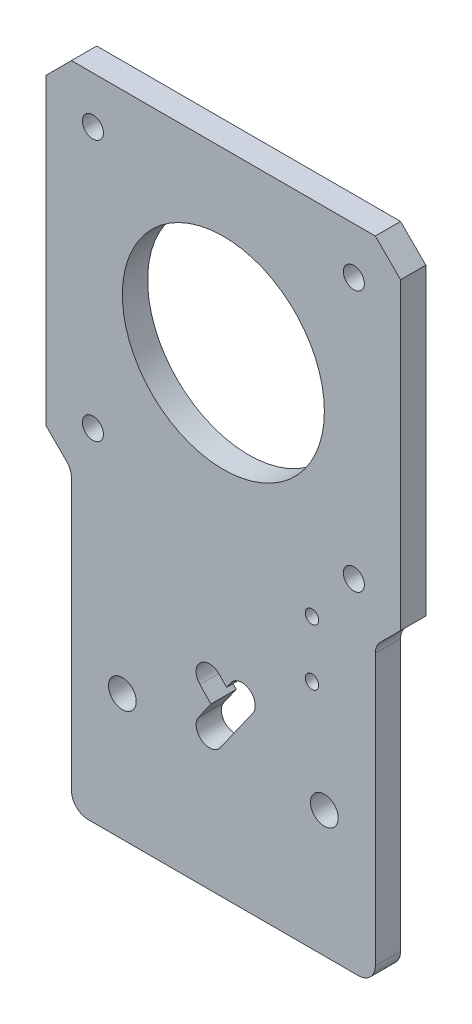
ISO-10303-21;
HEADER;
FILE_DESCRIPTION(('STEP AP214'),'2;1');
FILE_NAME('part.step','',(''),(''),'','','');
FILE_SCHEMA(('AUTOMOTIVE_DESIGN { 1 0 10303 214 1 1 1 1 }'));
ENDSEC;
DATA;
#1=APPLICATION_CONTEXT('core data for automotive mechanical design processes');
#2=APPLICATION_PROTOCOL_DEFINITION('international standard','automotive_design',2000,#1);
#3=PRODUCT_CONTEXT('',#1,'mechanical');
#4=PRODUCT('Part','Part','',(#3));
#5=PRODUCT_RELATED_PRODUCT_CATEGORY('part','',(#4));
#6=PRODUCT_DEFINITION_FORMATION('','',#4);
#7=PRODUCT_DEFINITION_CONTEXT('part definition',#1,'design');
#8=PRODUCT_DEFINITION('design','',#6,#7);
#9=PRODUCT_DEFINITION_SHAPE('','',#8);
#10=(LENGTH_UNIT() NAMED_UNIT(*) SI_UNIT(.MILLI.,.METRE.));
#11=(NAMED_UNIT(*) PLANE_ANGLE_UNIT() SI_UNIT($,.RADIAN.));
#12=(NAMED_UNIT(*) SI_UNIT($,.STERADIAN.) SOLID_ANGLE_UNIT());
#13=UNCERTAINTY_MEASURE_WITH_UNIT(LENGTH_MEASURE(1.E-05),#10,'distance_accuracy_value','');
#14=(GEOMETRIC_REPRESENTATION_CONTEXT(3) GLOBAL_UNCERTAINTY_ASSIGNED_CONTEXT((#13)) GLOBAL_UNIT_ASSIGNED_CONTEXT((#10,
#11,#12)) REPRESENTATION_CONTEXT('',''));
#15=CARTESIAN_POINT('',(0.,0.,0.));
#16=DIRECTION('',(0.,0.,1.));
#17=DIRECTION('',(1.,0.,0.));
#18=AXIS2_PLACEMENT_3D('',#15,#16,#17);
#19=CARTESIAN_POINT('',(0.,0.,3.));
#20=DIRECTION('',(0.,0.,-1.));
#21=DIRECTION('',(-1.,0.,0.));
#22=AXIS2_PLACEMENT_3D('',#19,#20,#21);
#23=PLANE('',#22);
#24=CARTESIAN_POINT('',(-1.64945517730673,-34.4013944195105,3.));
#25=DIRECTION('',(0.,0.,-1.));
#26=DIRECTION('',(-1.,0.,0.));
#27=AXIS2_PLACEMENT_3D('',#24,#25,#26);
#28=CIRCLE('',#27,1.58749999999999);
#29=CARTESIAN_POINT('',(-0.509366671944178,-33.2966978774954,3.));
#30=VERTEX_POINT('',#29);
#31=CARTESIAN_POINT('',(-2.78954368266929,-35.5060909615256,3.));
#32=VERTEX_POINT('',#31);
#33=EDGE_CURVE('E272',#30,#32,#28,.F.);
#34=ORIENTED_EDGE('',*,*,#33,.F.);
#35=DIRECTION('',(0.695871837489854,-0.718165987629945,0.));
#36=VECTOR('',#35,1.);
#37=CARTESIAN_POINT('',(-16.902786394314,-16.3780702922548,3.));
#38=LINE('',#37,#36);
#39=CARTESIAN_POINT('',(0.384994592721698,-34.2197124418635,3.));
#40=VERTEX_POINT('',#39);
#41=EDGE_CURVE('E191',#30,#40,#38,.T.);
#42=ORIENTED_EDGE('',*,*,#41,.T.);
#43=DIRECTION('',(-0.575176751990256,-0.818029158386142,0.));
#44=VECTOR('',#43,1.);
#45=CARTESIAN_POINT('',(16.3583907342518,-11.5019934850208,3.));
#46=LINE('',#45,#44);
#47=CARTESIAN_POINT('',(0.899268033755897,-33.488301325726,3.));
#48=VERTEX_POINT('',#47);
#49=EDGE_CURVE('E195',#48,#40,#46,.T.);
#50=ORIENTED_EDGE('',*,*,#49,.F.);
#51=CARTESIAN_POINT('',(2.19788932269389,-34.4013944195105,3.));
#52=DIRECTION('',(0.,0.,-1.));
#53=DIRECTION('',(-1.,0.,0.));
#54=AXIS2_PLACEMENT_3D('',#51,#52,#53);
#55=CIRCLE('',#54,1.58749999999999);
#56=CARTESIAN_POINT('',(3.49651061163189,-35.3144875132951,3.));
#57=VERTEX_POINT('',#56);
#58=EDGE_CURVE('E256',#57,#48,#55,.F.);
#59=ORIENTED_EDGE('',*,*,#58,.F.);
#60=DIRECTION('',(-0.575176751990257,-0.818029158386141,0.));
#61=VECTOR('',#60,1.);
#62=CARTESIAN_POINT('',(18.9556333121278,-13.3281796725899,3.));
#63=LINE('',#62,#61);
#64=CARTESIAN_POINT('',(-0.350833888368762,-40.7862663577404,3.));
#65=VERTEX_POINT('',#64);
#66=EDGE_CURVE('E259',#57,#65,#63,.T.);
#67=ORIENTED_EDGE('',*,*,#66,.T.);
#68=CARTESIAN_POINT('',(-1.64945517730673,-39.8731732639559,3.));
#69=DIRECTION('',(0.,0.,-1.));
#70=DIRECTION('',(-1.,0.,0.));
#71=AXIS2_PLACEMENT_3D('',#68,#69,#70);
#72=CIRCLE('',#71,1.58749999999999);
#73=CARTESIAN_POINT('',(-2.94807646624474,-38.9600801701714,3.));
#74=VERTEX_POINT('',#73);
#75=EDGE_CURVE('E263',#74,#65,#72,.F.);
#76=ORIENTED_EDGE('',*,*,#75,.F.);
#77=DIRECTION('',(-0.575176751990256,-0.818029158386142,0.));
#78=VECTOR('',#77,1.);
#79=CARTESIAN_POINT('',(16.3583907342518,-11.5019934850208,3.));
#80=LINE('',#79,#78);
#81=CARTESIAN_POINT('',(-1.47406755906194,-36.8637119466225,3.));
#82=VERTEX_POINT('',#81);
#83=EDGE_CURVE('E266',#82,#74,#80,.T.);
#84=ORIENTED_EDGE('',*,*,#83,.F.);
#85=DIRECTION('',(0.695871837489838,-0.71816598762996,0.));
#86=VECTOR('',#85,1.);
#87=CARTESIAN_POINT('',(-19.1829634050391,-18.5874633762843,3.));
#88=LINE('',#87,#86);
#89=EDGE_CURVE('E269',#32,#82,#88,.T.);
#90=ORIENTED_EDGE('',*,*,#89,.F.);
#91=EDGE_LOOP('',(#34,#42,#50,#59,#67,#76,#84,#90));
#92=FACE_BOUND('',#91,.T.);
#93=CARTESIAN_POINT('',(10.5294560297045,-21.8613101499908,3.));
#94=DIRECTION('',(0.,0.,1.));
#95=DIRECTION('',(1.,0.,0.));
#96=AXIS2_PLACEMENT_3D('',#93,#94,#95);
#97=CIRCLE('',#96,0.799999999999999);
#98=CARTESIAN_POINT('',(11.3294560297045,-21.8613101499908,3.));
#99=VERTEX_POINT('',#98);
#100=EDGE_CURVE('E277',#99,#99,#97,.T.);
#101=ORIENTED_EDGE('',*,*,#100,.F.);
#102=EDGE_LOOP('',(#101));
#103=FACE_BOUND('',#102,.T.);
#104=CARTESIAN_POINT('',(10.5294560297045,-28.5613101499908,3.));
#105=DIRECTION('',(0.,0.,1.));
#106=DIRECTION('',(1.,0.,0.));
#107=AXIS2_PLACEMENT_3D('',#104,#105,#106);
#108=CIRCLE('',#107,0.799999999999999);
#109=CARTESIAN_POINT('',(11.3294560297045,-28.5613101499908,3.));
#110=VERTEX_POINT('',#109);
#111=EDGE_CURVE('E285',#110,#110,#108,.T.);
#112=ORIENTED_EDGE('',*,*,#111,.F.);
#113=EDGE_LOOP('',(#112));
#114=FACE_BOUND('',#113,.T.);
#115=CARTESIAN_POINT('',(-12.,-41.0549999999989,3.));
#116=DIRECTION('',(0.,0.,1.));
#117=DIRECTION('',(1.,0.,0.));
#118=AXIS2_PLACEMENT_3D('',#115,#116,#117);
#119=CIRCLE('',#118,1.65);
#120=CARTESIAN_POINT('',(-10.35,-41.0549999999989,3.));
#121=VERTEX_POINT('',#120);
#122=EDGE_CURVE('E293',#121,#121,#119,.T.);
#123=ORIENTED_EDGE('',*,*,#122,.F.);
#124=EDGE_LOOP('',(#123));
#125=FACE_BOUND('',#124,.T.);
#126=CARTESIAN_POINT('',(12.,-41.0549999999989,3.));
#127=DIRECTION('',(0.,0.,1.));
#128=DIRECTION('',(1.,0.,0.));
#129=AXIS2_PLACEMENT_3D('',#126,#127,#128);
#130=CIRCLE('',#129,1.65);
#131=CARTESIAN_POINT('',(13.65,-41.0549999999989,3.));
#132=VERTEX_POINT('',#131);
#133=EDGE_CURVE('E301',#132,#132,#130,.T.);
#134=ORIENTED_EDGE('',*,*,#133,.F.);
#135=EDGE_LOOP('',(#134));
#136=FACE_BOUND('',#135,.T.);
#137=CARTESIAN_POINT('',(-15.5,15.4999999999999,3.));
#138=DIRECTION('',(0.,0.,1.));
#139=DIRECTION('',(1.,0.,0.));
#140=AXIS2_PLACEMENT_3D('',#137,#138,#139);
#141=CIRCLE('',#140,1.24999999999999);
#142=CARTESIAN_POINT('',(-14.25,15.4999999999999,3.));
#143=VERTEX_POINT('',#142);
#144=EDGE_CURVE('E309',#143,#143,#141,.T.);
#145=ORIENTED_EDGE('',*,*,#144,.F.);
#146=EDGE_LOOP('',(#145));
#147=FACE_BOUND('',#146,.T.);
#148=CARTESIAN_POINT('',(15.5,15.4999999999999,3.));
#149=DIRECTION('',(0.,0.,1.));
#150=DIRECTION('',(1.,0.,0.));
#151=AXIS2_PLACEMENT_3D('',#148,#149,#150);
#152=CIRCLE('',#151,1.24999999999999);
#153=CARTESIAN_POINT('',(16.75,15.4999999999999,3.));
#154=VERTEX_POINT('',#153);
#155=EDGE_CURVE('E317',#154,#154,#152,.T.);
#156=ORIENTED_EDGE('',*,*,#155,.F.);
#157=EDGE_LOOP('',(#156));
#158=FACE_BOUND('',#157,.T.);
#159=CARTESIAN_POINT('',(-15.5,-15.5000000000001,3.));
#160=DIRECTION('',(0.,0.,1.));
#161=DIRECTION('',(1.,0.,0.));
#162=AXIS2_PLACEMENT_3D('',#159,#160,#161);
#163=CIRCLE('',#162,1.24999999999999);
#164=CARTESIAN_POINT('',(-14.25,-15.5000000000001,3.));
#165=VERTEX_POINT('',#164);
#166=EDGE_CURVE('E322',#165,#165,#163,.T.);
#167=ORIENTED_EDGE('',*,*,#166,.F.);
#168=EDGE_LOOP('',(#167));
#169=FACE_BOUND('',#168,.T.);
#170=CARTESIAN_POINT('',(15.5,-15.5000000000001,3.));
#171=DIRECTION('',(0.,0.,1.));
#172=DIRECTION('',(1.,0.,0.));
#173=AXIS2_PLACEMENT_3D('',#170,#171,#172);
#174=CIRCLE('',#173,1.24999999999999);
#175=CARTESIAN_POINT('',(16.75,-15.5000000000001,3.));
#176=VERTEX_POINT('',#175);
#177=EDGE_CURVE('E330',#176,#176,#174,.T.);
#178=ORIENTED_EDGE('',*,*,#177,.F.);
#179=EDGE_LOOP('',(#178));
#180=FACE_BOUND('',#179,.T.);
#181=DIRECTION('',(1.,0.,0.));
#182=VECTOR('',#181,1.);
#183=CARTESIAN_POINT('',(18.05,-56.0549999999989,3.));
#184=LINE('',#183,#182);
#185=CARTESIAN_POINT('',(-16.05,-56.0549999999989,3.));
#186=VERTEX_POINT('',#185);
#187=CARTESIAN_POINT('',(16.05,-56.0549999999989,3.));
#188=VERTEX_POINT('',#187);
#189=EDGE_CURVE('E357',#186,#188,#184,.T.);
#190=ORIENTED_EDGE('',*,*,#189,.T.);
#191=CARTESIAN_POINT('',(16.05,-54.0549999999989,3.));
#192=DIRECTION('',(0.,0.,-1.));
#193=DIRECTION('',(-1.,0.,0.));
#194=AXIS2_PLACEMENT_3D('',#191,#192,#193);
#195=CIRCLE('',#194,2.);
#196=CARTESIAN_POINT('',(18.05,-54.0549999999989,3.));
#197=VERTEX_POINT('',#196);
#198=EDGE_CURVE('E470',#188,#197,#195,.F.);
#199=ORIENTED_EDGE('',*,*,#198,.T.);
#200=DIRECTION('',(0.,1.,0.));
#201=VECTOR('',#200,1.);
#202=CARTESIAN_POINT('',(18.05,-56.0549999999989,3.));
#203=LINE('',#202,#201);
#204=CARTESIAN_POINT('',(18.05,-21.8784271247463,3.));
#205=VERTEX_POINT('',#204);
#206=EDGE_CURVE('E361',#197,#205,#203,.T.);
#207=ORIENTED_EDGE('',*,*,#206,.T.);
#208=CARTESIAN_POINT('',(20.05,-21.8784271247463,3.));
#209=DIRECTION('',(0.,0.,-1.));
#210=DIRECTION('',(-1.,0.,0.));
#211=AXIS2_PLACEMENT_3D('',#208,#209,#210);
#212=CIRCLE('',#211,2.);
#213=CARTESIAN_POINT('',(18.6357864376269,-20.4642135623732,3.));
#214=VERTEX_POINT('',#213);
#215=EDGE_CURVE('E486',#205,#214,#212,.T.);
#216=ORIENTED_EDGE('',*,*,#215,.T.);
#217=DIRECTION('',(0.707106781186547,0.707106781186548,0.));
#218=VECTOR('',#217,1.);
#219=CARTESIAN_POINT('',(18.05,-21.0500000000001,3.));
#220=LINE('',#219,#218);
#221=CARTESIAN_POINT('',(21.05,-18.0500000000001,3.));
#222=VERTEX_POINT('',#221);
#223=EDGE_CURVE('E365',#214,#222,#220,.T.);
#224=ORIENTED_EDGE('',*,*,#223,.T.);
#225=DIRECTION('',(0.,1.,0.));
#226=VECTOR('',#225,1.);
#227=CARTESIAN_POINT('',(21.05,-18.0500000000001,3.));
#228=LINE('',#227,#226);
#229=CARTESIAN_POINT('',(21.05,18.0499999999999,3.));
#230=VERTEX_POINT('',#229);
#231=EDGE_CURVE('E368',#222,#230,#228,.T.);
#232=ORIENTED_EDGE('',*,*,#231,.T.);
#233=DIRECTION('',(-0.707106781186547,0.707106781186548,0.));
#234=VECTOR('',#233,1.);
#235=CARTESIAN_POINT('',(21.05,18.0499999999999,3.));
#236=LINE('',#235,#234);
#237=CARTESIAN_POINT('',(18.05,21.0499999999999,3.));
#238=VERTEX_POINT('',#237);
#239=EDGE_CURVE('E371',#230,#238,#236,.T.);
#240=ORIENTED_EDGE('',*,*,#239,.T.);
#241=DIRECTION('',(-1.,0.,0.));
#242=VECTOR('',#241,1.);
#243=CARTESIAN_POINT('',(18.05,21.0499999999999,3.));
#244=LINE('',#243,#242);
#245=CARTESIAN_POINT('',(-18.05,21.0499999999999,3.));
#246=VERTEX_POINT('',#245);
#247=EDGE_CURVE('E374',#238,#246,#244,.T.);
#248=ORIENTED_EDGE('',*,*,#247,.T.);
#249=DIRECTION('',(-0.707106781186547,-0.707106781186548,0.));
#250=VECTOR('',#249,1.);
#251=CARTESIAN_POINT('',(-18.05,21.0499999999999,3.));
#252=LINE('',#251,#250);
#253=CARTESIAN_POINT('',(-21.05,18.0499999999999,3.));
#254=VERTEX_POINT('',#253);
#255=EDGE_CURVE('E377',#246,#254,#252,.T.);
#256=ORIENTED_EDGE('',*,*,#255,.T.);
#257=DIRECTION('',(0.,-1.,0.));
#258=VECTOR('',#257,1.);
#259=CARTESIAN_POINT('',(-21.05,18.0499999999999,3.));
#260=LINE('',#259,#258);
#261=CARTESIAN_POINT('',(-21.05,-18.0500000000001,3.));
#262=VERTEX_POINT('',#261);
#263=EDGE_CURVE('E344',#254,#262,#260,.T.);
#264=ORIENTED_EDGE('',*,*,#263,.T.);
#265=DIRECTION('',(0.707106781186547,-0.707106781186548,0.));
#266=VECTOR('',#265,1.);
#267=CARTESIAN_POINT('',(-21.05,-18.0500000000001,3.));
#268=LINE('',#267,#266);
#269=CARTESIAN_POINT('',(-18.6357864376269,-20.4642135623732,3.));
#270=VERTEX_POINT('',#269);
#271=EDGE_CURVE('E348',#262,#270,#268,.T.);
#272=ORIENTED_EDGE('',*,*,#271,.T.);
#273=CARTESIAN_POINT('',(-20.05,-21.8784271247463,3.));
#274=DIRECTION('',(0.,0.,-1.));
#275=DIRECTION('',(-1.,0.,0.));
#276=AXIS2_PLACEMENT_3D('',#273,#274,#275);
#277=CIRCLE('',#276,2.);
#278=CARTESIAN_POINT('',(-18.05,-21.8784271247463,3.));
#279=VERTEX_POINT('',#278);
#280=EDGE_CURVE('E12',#270,#279,#277,.T.);
#281=ORIENTED_EDGE('',*,*,#280,.T.);
#282=DIRECTION('',(0.,-1.,0.));
#283=VECTOR('',#282,1.);
#284=CARTESIAN_POINT('',(-18.05,-56.0549999999989,3.));
#285=LINE('',#284,#283);
#286=CARTESIAN_POINT('',(-18.05,-54.0549999999989,3.));
#287=VERTEX_POINT('',#286);
#288=EDGE_CURVE('E353',#279,#287,#285,.T.);
#289=ORIENTED_EDGE('',*,*,#288,.T.);
#290=CARTESIAN_POINT('',(-16.05,-54.0549999999989,3.));
#291=DIRECTION('',(0.,0.,-1.));
#292=DIRECTION('',(-1.,0.,0.));
#293=AXIS2_PLACEMENT_3D('',#290,#291,#292);
#294=CIRCLE('',#293,2.);
#295=EDGE_CURVE('E467',#287,#186,#294,.F.);
#296=ORIENTED_EDGE('',*,*,#295,.T.);
#297=EDGE_LOOP('',(#190,#199,#207,#216,#224,#232,#240,#248,#256,#264,#272,#281,#289,#296));
#298=FACE_BOUND('',#297,.T.);
#299=CARTESIAN_POINT('',(0.,-1.11022302462516E-13,3.));
#300=DIRECTION('',(0.,0.,1.));
#301=DIRECTION('',(1.,0.,0.));
#302=AXIS2_PLACEMENT_3D('',#299,#300,#301);
#303=CIRCLE('',#302,12.);
#304=CARTESIAN_POINT('',(12.,-1.11022302462516E-13,3.));
#305=VERTEX_POINT('',#304);
#306=EDGE_CURVE('E335',#305,#305,#303,.T.);
#307=ORIENTED_EDGE('',*,*,#306,.F.);
#308=EDGE_LOOP('',(#307));
#309=FACE_BOUND('',#308,.T.);
#310=ADVANCED_FACE('F39',(#92,#103,#114,#125,#136,#147,#158,#169,#180,#298,#309),#23,.F.);
#311=CARTESIAN_POINT('',(0.,0.,0.));
#312=DIRECTION('',(0.,0.,-1.));
#313=DIRECTION('',(-1.,0.,0.));
#314=AXIS2_PLACEMENT_3D('',#311,#312,#313);
#315=PLANE('',#314);
#316=DIRECTION('',(0.695871837489854,-0.718165987629945,0.));
#317=VECTOR('',#316,1.);
#318=CARTESIAN_POINT('',(-16.902786394314,-16.3780702922548,0.));
#319=LINE('',#318,#317);
#320=CARTESIAN_POINT('',(-0.509366671944178,-33.2966978774954,0.));
#321=VERTEX_POINT('',#320);
#322=CARTESIAN_POINT('',(0.384994592721698,-34.2197124418635,0.));
#323=VERTEX_POINT('',#322);
#324=EDGE_CURVE('E63',#321,#323,#319,.T.);
#325=ORIENTED_EDGE('',*,*,#324,.F.);
#326=CARTESIAN_POINT('',(-1.64945517730673,-34.4013944195105,0.));
#327=DIRECTION('',(0.,0.,1.));
#328=DIRECTION('',(1.,0.,0.));
#329=AXIS2_PLACEMENT_3D('',#326,#327,#328);
#330=CIRCLE('',#329,1.58749999999999);
#331=CARTESIAN_POINT('',(-2.78954368266929,-35.5060909615256,0.));
#332=VERTEX_POINT('',#331);
#333=EDGE_CURVE('E199',#321,#332,#330,.T.);
#334=ORIENTED_EDGE('',*,*,#333,.T.);
#335=DIRECTION('',(0.695871837489838,-0.71816598762996,0.));
#336=VECTOR('',#335,1.);
#337=CARTESIAN_POINT('',(-19.1829634050391,-18.5874633762843,0.));
#338=LINE('',#337,#336);
#339=CARTESIAN_POINT('',(-1.47406755906194,-36.8637119466225,0.));
#340=VERTEX_POINT('',#339);
#341=EDGE_CURVE('E206',#332,#340,#338,.T.);
#342=ORIENTED_EDGE('',*,*,#341,.T.);
#343=DIRECTION('',(-0.575176751990256,-0.818029158386142,0.));
#344=VECTOR('',#343,1.);
#345=CARTESIAN_POINT('',(16.3583907342518,-11.5019934850208,0.));
#346=LINE('',#345,#344);
#347=CARTESIAN_POINT('',(-2.94807646624474,-38.9600801701714,0.));
#348=VERTEX_POINT('',#347);
#349=EDGE_CURVE('E218',#340,#348,#346,.T.);
#350=ORIENTED_EDGE('',*,*,#349,.T.);
#351=CARTESIAN_POINT('',(-1.64945517730673,-39.8731732639559,0.));
#352=DIRECTION('',(0.,0.,1.));
#353=DIRECTION('',(1.,0.,0.));
#354=AXIS2_PLACEMENT_3D('',#351,#352,#353);
#355=CIRCLE('',#354,1.58749999999999);
#356=CARTESIAN_POINT('',(-0.350833888368762,-40.7862663577404,0.));
#357=VERTEX_POINT('',#356);
#358=EDGE_CURVE('E222',#348,#357,#355,.T.);
#359=ORIENTED_EDGE('',*,*,#358,.T.);
#360=DIRECTION('',(-0.575176751990257,-0.818029158386141,0.));
#361=VECTOR('',#360,1.);
#362=CARTESIAN_POINT('',(18.9556333121278,-13.3281796725899,0.));
#363=LINE('',#362,#361);
#364=CARTESIAN_POINT('',(3.49651061163189,-35.3144875132951,0.));
#365=VERTEX_POINT('',#364);
#366=EDGE_CURVE('E226',#365,#357,#363,.T.);
#367=ORIENTED_EDGE('',*,*,#366,.F.);
#368=CARTESIAN_POINT('',(2.19788932269389,-34.4013944195105,0.));
#369=DIRECTION('',(0.,0.,1.));
#370=DIRECTION('',(1.,0.,0.));
#371=AXIS2_PLACEMENT_3D('',#368,#369,#370);
#372=CIRCLE('',#371,1.58749999999999);
#373=CARTESIAN_POINT('',(0.899268033755897,-33.488301325726,0.));
#374=VERTEX_POINT('',#373);
#375=EDGE_CURVE('E230',#365,#374,#372,.T.);
#376=ORIENTED_EDGE('',*,*,#375,.T.);
#377=DIRECTION('',(-0.575176751990256,-0.818029158386142,0.));
#378=VECTOR('',#377,1.);
#379=CARTESIAN_POINT('',(16.3583907342518,-11.5019934850208,0.));
#380=LINE('',#379,#378);
#381=EDGE_CURVE('E212',#374,#323,#380,.T.);
#382=ORIENTED_EDGE('',*,*,#381,.T.);
#383=EDGE_LOOP('',(#325,#334,#342,#350,#359,#367,#376,#382));
#384=FACE_BOUND('',#383,.T.);
#385=CARTESIAN_POINT('',(10.5294560297045,-21.8613101499908,0.));
#386=DIRECTION('',(0.,0.,-1.));
#387=DIRECTION('',(-1.,0.,0.));
#388=AXIS2_PLACEMENT_3D('',#385,#386,#387);
#389=CIRCLE('',#388,0.799999999999999);
#390=CARTESIAN_POINT('',(9.72945602970451,-21.8613101499908,0.));
#391=VERTEX_POINT('',#390);
#392=EDGE_CURVE('E281',#391,#391,#389,.T.);
#393=ORIENTED_EDGE('',*,*,#392,.F.);
#394=EDGE_LOOP('',(#393));
#395=FACE_BOUND('',#394,.T.);
#396=CARTESIAN_POINT('',(10.5294560297045,-28.5613101499908,0.));
#397=DIRECTION('',(0.,0.,-1.));
#398=DIRECTION('',(-1.,0.,0.));
#399=AXIS2_PLACEMENT_3D('',#396,#397,#398);
#400=CIRCLE('',#399,0.799999999999999);
#401=CARTESIAN_POINT('',(9.72945602970451,-28.5613101499908,0.));
#402=VERTEX_POINT('',#401);
#403=EDGE_CURVE('E289',#402,#402,#400,.T.);
#404=ORIENTED_EDGE('',*,*,#403,.F.);
#405=EDGE_LOOP('',(#404));
#406=FACE_BOUND('',#405,.T.);
#407=CARTESIAN_POINT('',(-12.,-41.0549999999989,0.));
#408=DIRECTION('',(0.,0.,-1.));
#409=DIRECTION('',(-1.,0.,0.));
#410=AXIS2_PLACEMENT_3D('',#407,#408,#409);
#411=CIRCLE('',#410,1.65);
#412=CARTESIAN_POINT('',(-13.65,-41.0549999999989,0.));
#413=VERTEX_POINT('',#412);
#414=EDGE_CURVE('E297',#413,#413,#411,.T.);
#415=ORIENTED_EDGE('',*,*,#414,.F.);
#416=EDGE_LOOP('',(#415));
#417=FACE_BOUND('',#416,.T.);
#418=CARTESIAN_POINT('',(12.,-41.0549999999989,0.));
#419=DIRECTION('',(0.,0.,-1.));
#420=DIRECTION('',(-1.,0.,0.));
#421=AXIS2_PLACEMENT_3D('',#418,#419,#420);
#422=CIRCLE('',#421,1.65);
#423=CARTESIAN_POINT('',(10.35,-41.0549999999989,0.));
#424=VERTEX_POINT('',#423);
#425=EDGE_CURVE('E305',#424,#424,#422,.T.);
#426=ORIENTED_EDGE('',*,*,#425,.F.);
#427=EDGE_LOOP('',(#426));
#428=FACE_BOUND('',#427,.T.);
#429=CARTESIAN_POINT('',(-15.5,15.4999999999999,0.));
#430=DIRECTION('',(0.,0.,-1.));
#431=DIRECTION('',(-1.,0.,0.));
#432=AXIS2_PLACEMENT_3D('',#429,#430,#431);
#433=CIRCLE('',#432,1.24999999999999);
#434=CARTESIAN_POINT('',(-16.75,15.4999999999999,0.));
#435=VERTEX_POINT('',#434);
#436=EDGE_CURVE('E313',#435,#435,#433,.T.);
#437=ORIENTED_EDGE('',*,*,#436,.F.);
#438=EDGE_LOOP('',(#437));
#439=FACE_BOUND('',#438,.T.);
#440=CARTESIAN_POINT('',(15.5,15.4999999999999,0.));
#441=DIRECTION('',(0.,0.,-1.));
#442=DIRECTION('',(-1.,0.,0.));
#443=AXIS2_PLACEMENT_3D('',#440,#441,#442);
#444=CIRCLE('',#443,1.24999999999999);
#445=CARTESIAN_POINT('',(14.25,15.4999999999999,0.));
#446=VERTEX_POINT('',#445);
#447=EDGE_CURVE('E321',#446,#446,#444,.T.);
#448=ORIENTED_EDGE('',*,*,#447,.F.);
#449=EDGE_LOOP('',(#448));
#450=FACE_BOUND('',#449,.T.);
#451=CARTESIAN_POINT('',(-15.5,-15.5000000000001,0.));
#452=DIRECTION('',(0.,0.,-1.));
#453=DIRECTION('',(-1.,0.,0.));
#454=AXIS2_PLACEMENT_3D('',#451,#452,#453);
#455=CIRCLE('',#454,1.24999999999999);
#456=CARTESIAN_POINT('',(-16.75,-15.5000000000001,0.));
#457=VERTEX_POINT('',#456);
#458=EDGE_CURVE('E326',#457,#457,#455,.T.);
#459=ORIENTED_EDGE('',*,*,#458,.F.);
#460=EDGE_LOOP('',(#459));
#461=FACE_BOUND('',#460,.T.);
#462=CARTESIAN_POINT('',(15.5,-15.5000000000001,0.));
#463=DIRECTION('',(0.,0.,-1.));
#464=DIRECTION('',(-1.,0.,0.));
#465=AXIS2_PLACEMENT_3D('',#462,#463,#464);
#466=CIRCLE('',#465,1.24999999999999);
#467=CARTESIAN_POINT('',(14.25,-15.5000000000001,0.));
#468=VERTEX_POINT('',#467);
#469=EDGE_CURVE('E334',#468,#468,#466,.T.);
#470=ORIENTED_EDGE('',*,*,#469,.F.);
#471=EDGE_LOOP('',(#470));
#472=FACE_BOUND('',#471,.T.);
#473=DIRECTION('',(0.,1.,0.));
#474=VECTOR('',#473,1.);
#475=CARTESIAN_POINT('',(18.05,-56.0549999999989,0.));
#476=LINE('',#475,#474);
#477=CARTESIAN_POINT('',(18.05,-54.0549999999989,0.));
#478=VERTEX_POINT('',#477);
#479=CARTESIAN_POINT('',(18.05,-21.8784271247463,0.));
#480=VERTEX_POINT('',#479);
#481=EDGE_CURVE('E396',#478,#480,#476,.T.);
#482=ORIENTED_EDGE('',*,*,#481,.F.);
#483=CARTESIAN_POINT('',(16.05,-54.0549999999989,0.));
#484=DIRECTION('',(0.,0.,-1.));
#485=DIRECTION('',(-1.,0.,0.));
#486=AXIS2_PLACEMENT_3D('',#483,#484,#485);
#487=CIRCLE('',#486,2.);
#488=CARTESIAN_POINT('',(16.05,-56.0549999999989,0.));
#489=VERTEX_POINT('',#488);
#490=EDGE_CURVE('E457',#478,#489,#487,.T.);
#491=ORIENTED_EDGE('',*,*,#490,.T.);
#492=DIRECTION('',(1.,0.,0.));
#493=VECTOR('',#492,1.);
#494=CARTESIAN_POINT('',(18.05,-56.0549999999989,0.));
#495=LINE('',#494,#493);
#496=CARTESIAN_POINT('',(-16.05,-56.0549999999989,0.));
#497=VERTEX_POINT('',#496);
#498=EDGE_CURVE('E392',#497,#489,#495,.T.);
#499=ORIENTED_EDGE('',*,*,#498,.F.);
#500=CARTESIAN_POINT('',(-16.05,-54.0549999999989,0.));
#501=DIRECTION('',(0.,0.,-1.));
#502=DIRECTION('',(-1.,0.,0.));
#503=AXIS2_PLACEMENT_3D('',#500,#501,#502);
#504=CIRCLE('',#503,2.);
#505=CARTESIAN_POINT('',(-18.05,-54.0549999999989,0.));
#506=VERTEX_POINT('',#505);
#507=EDGE_CURVE('E454',#497,#506,#504,.T.);
#508=ORIENTED_EDGE('',*,*,#507,.T.);
#509=DIRECTION('',(0.,-1.,0.));
#510=VECTOR('',#509,1.);
#511=CARTESIAN_POINT('',(-18.05,-56.0549999999989,0.));
#512=LINE('',#511,#510);
#513=CARTESIAN_POINT('',(-18.05,-21.8784271247463,0.));
#514=VERTEX_POINT('',#513);
#515=EDGE_CURVE('E388',#514,#506,#512,.T.);
#516=ORIENTED_EDGE('',*,*,#515,.F.);
#517=CARTESIAN_POINT('',(-20.05,-21.8784271247463,0.));
#518=DIRECTION('',(0.,0.,-1.));
#519=DIRECTION('',(-1.,0.,0.));
#520=AXIS2_PLACEMENT_3D('',#517,#518,#519);
#521=CIRCLE('',#520,2.);
#522=CARTESIAN_POINT('',(-18.6357864376269,-20.4642135623732,0.));
#523=VERTEX_POINT('',#522);
#524=EDGE_CURVE('E48',#514,#523,#521,.F.);
#525=ORIENTED_EDGE('',*,*,#524,.T.);
#526=DIRECTION('',(0.707106781186547,-0.707106781186548,0.));
#527=VECTOR('',#526,1.);
#528=CARTESIAN_POINT('',(-21.05,-18.0500000000001,0.));
#529=LINE('',#528,#527);
#530=CARTESIAN_POINT('',(-21.05,-18.0500000000001,0.));
#531=VERTEX_POINT('',#530);
#532=EDGE_CURVE('E384',#531,#523,#529,.T.);
#533=ORIENTED_EDGE('',*,*,#532,.F.);
#534=DIRECTION('',(0.,-1.,0.));
#535=VECTOR('',#534,1.);
#536=CARTESIAN_POINT('',(-21.05,18.0499999999999,0.));
#537=LINE('',#536,#535);
#538=CARTESIAN_POINT('',(-21.05,18.0499999999999,0.));
#539=VERTEX_POINT('',#538);
#540=EDGE_CURVE('E339',#539,#531,#537,.T.);
#541=ORIENTED_EDGE('',*,*,#540,.F.);
#542=DIRECTION('',(-0.707106781186547,-0.707106781186548,0.));
#543=VECTOR('',#542,1.);
#544=CARTESIAN_POINT('',(-18.05,21.0499999999999,0.));
#545=LINE('',#544,#543);
#546=CARTESIAN_POINT('',(-18.05,21.0499999999999,0.));
#547=VERTEX_POINT('',#546);
#548=EDGE_CURVE('E349',#547,#539,#545,.T.);
#549=ORIENTED_EDGE('',*,*,#548,.F.);
#550=DIRECTION('',(-1.,0.,0.));
#551=VECTOR('',#550,1.);
#552=CARTESIAN_POINT('',(18.05,21.0499999999999,0.));
#553=LINE('',#552,#551);
#554=CARTESIAN_POINT('',(18.05,21.0499999999999,0.));
#555=VERTEX_POINT('',#554);
#556=EDGE_CURVE('E409',#555,#547,#553,.T.);
#557=ORIENTED_EDGE('',*,*,#556,.F.);
#558=DIRECTION('',(-0.707106781186547,0.707106781186548,0.));
#559=VECTOR('',#558,1.);
#560=CARTESIAN_POINT('',(21.05,18.0499999999999,0.));
#561=LINE('',#560,#559);
#562=CARTESIAN_POINT('',(21.05,18.0499999999999,0.));
#563=VERTEX_POINT('',#562);
#564=EDGE_CURVE('E406',#563,#555,#561,.T.);
#565=ORIENTED_EDGE('',*,*,#564,.F.);
#566=DIRECTION('',(0.,1.,0.));
#567=VECTOR('',#566,1.);
#568=CARTESIAN_POINT('',(21.05,-18.0500000000001,0.));
#569=LINE('',#568,#567);
#570=CARTESIAN_POINT('',(21.05,-18.0500000000001,0.));
#571=VERTEX_POINT('',#570);
#572=EDGE_CURVE('E403',#571,#563,#569,.T.);
#573=ORIENTED_EDGE('',*,*,#572,.F.);
#574=DIRECTION('',(0.707106781186547,0.707106781186548,0.));
#575=VECTOR('',#574,1.);
#576=CARTESIAN_POINT('',(18.05,-21.0500000000001,0.));
#577=LINE('',#576,#575);
#578=CARTESIAN_POINT('',(18.6357864376269,-20.4642135623732,0.));
#579=VERTEX_POINT('',#578);
#580=EDGE_CURVE('E400',#579,#571,#577,.T.);
#581=ORIENTED_EDGE('',*,*,#580,.F.);
#582=CARTESIAN_POINT('',(20.05,-21.8784271247463,0.));
#583=DIRECTION('',(0.,0.,-1.));
#584=DIRECTION('',(-1.,0.,0.));
#585=AXIS2_PLACEMENT_3D('',#582,#583,#584);
#586=CIRCLE('',#585,2.);
#587=EDGE_CURVE('E483',#579,#480,#586,.F.);
#588=ORIENTED_EDGE('',*,*,#587,.T.);
#589=EDGE_LOOP('',(#482,#491,#499,#508,#516,#525,#533,#541,#549,#557,#565,#573,#581,#588));
#590=FACE_BOUND('',#589,.T.);
#591=CARTESIAN_POINT('',(0.,-1.11022302462516E-13,0.));
#592=DIRECTION('',(0.,0.,1.));
#593=DIRECTION('',(1.,0.,0.));
#594=AXIS2_PLACEMENT_3D('',#591,#592,#593);
#595=CIRCLE('',#594,12.);
#596=CARTESIAN_POINT('',(12.,-1.11022302462516E-13,0.));
#597=VERTEX_POINT('',#596);
#598=EDGE_CURVE('E340',#597,#597,#595,.T.);
#599=ORIENTED_EDGE('',*,*,#598,.T.);
#600=EDGE_LOOP('',(#599));
#601=FACE_BOUND('',#600,.T.);
#602=ADVANCED_FACE('F209',(#384,#395,#406,#417,#428,#439,#450,#461,#472,#590,#601),#315,.T.);
#603=CARTESIAN_POINT('',(-21.05,18.0499999999999,3.));
#604=DIRECTION('',(1.,0.,0.));
#605=DIRECTION('',(0.,0.,-1.));
#606=AXIS2_PLACEMENT_3D('',#603,#604,#605);
#607=PLANE('',#606);
#608=ORIENTED_EDGE('',*,*,#540,.T.);
#609=DIRECTION('',(0.,0.,-1.));
#610=VECTOR('',#609,1.);
#611=CARTESIAN_POINT('',(-21.05,-18.0500000000001,3.));
#612=LINE('',#611,#610);
#613=EDGE_CURVE('E433',#262,#531,#612,.T.);
#614=ORIENTED_EDGE('',*,*,#613,.F.);
#615=ORIENTED_EDGE('',*,*,#263,.F.);
#616=DIRECTION('',(0.,0.,-1.));
#617=VECTOR('',#616,1.);
#618=CARTESIAN_POINT('',(-21.05,18.0499999999999,3.));
#619=LINE('',#618,#617);
#620=EDGE_CURVE('E380',#254,#539,#619,.T.);
#621=ORIENTED_EDGE('',*,*,#620,.T.);
#622=EDGE_LOOP('',(#608,#614,#615,#621));
#623=FACE_BOUND('',#622,.T.);
#624=ADVANCED_FACE('F555',(#623),#607,.F.);
#625=CARTESIAN_POINT('',(-21.05,-18.0500000000001,3.));
#626=DIRECTION('',(0.707106781186548,0.707106781186547,0.));
#627=DIRECTION('',(-0.707106781186547,0.707106781186548,0.));
#628=AXIS2_PLACEMENT_3D('',#625,#626,#627);
#629=PLANE('',#628);
#630=ORIENTED_EDGE('',*,*,#532,.T.);
#631=DIRECTION('',(0.,0.,-1.));
#632=VECTOR('',#631,1.);
#633=CARTESIAN_POINT('',(-18.6357864376269,-20.4642135623732,3.));
#634=LINE('',#633,#632);
#635=EDGE_CURVE('E480',#523,#270,#634,.F.);
#636=ORIENTED_EDGE('',*,*,#635,.T.);
#637=ORIENTED_EDGE('',*,*,#271,.F.);
#638=ORIENTED_EDGE('',*,*,#613,.T.);
#639=EDGE_LOOP('',(#630,#636,#637,#638));
#640=FACE_BOUND('',#639,.T.);
#641=ADVANCED_FACE('F498',(#640),#629,.F.);
#642=CARTESIAN_POINT('',(-18.05,-56.0549999999989,3.));
#643=DIRECTION('',(1.,0.,0.));
#644=DIRECTION('',(0.,1.,0.));
#645=AXIS2_PLACEMENT_3D('',#642,#643,#644);
#646=PLANE('',#645);
#647=ORIENTED_EDGE('',*,*,#515,.T.);
#648=DIRECTION('',(0.,0.,-1.));
#649=VECTOR('',#648,1.);
#650=CARTESIAN_POINT('',(-18.05,-54.0549999999989,3.));
#651=LINE('',#650,#649);
#652=EDGE_CURVE('E477',#506,#287,#651,.F.);
#653=ORIENTED_EDGE('',*,*,#652,.T.);
#654=ORIENTED_EDGE('',*,*,#288,.F.);
#655=DIRECTION('',(0.,0.,-1.));
#656=VECTOR('',#655,1.);
#657=CARTESIAN_POINT('',(-18.05,-21.8784271247463,0.));
#658=LINE('',#657,#656);
#659=EDGE_CURVE('E473',#279,#514,#658,.T.);
#660=ORIENTED_EDGE('',*,*,#659,.T.);
#661=EDGE_LOOP('',(#647,#653,#654,#660));
#662=FACE_BOUND('',#661,.T.);
#663=ADVANCED_FACE('F506',(#662),#646,.F.);
#664=CARTESIAN_POINT('',(18.05,-56.0549999999989,3.));
#665=DIRECTION('',(0.,1.,0.));
#666=DIRECTION('',(0.,0.,1.));
#667=AXIS2_PLACEMENT_3D('',#664,#665,#666);
#668=PLANE('',#667);
#669=ORIENTED_EDGE('',*,*,#498,.T.);
#670=DIRECTION('',(0.,0.,-1.));
#671=VECTOR('',#670,1.);
#672=CARTESIAN_POINT('',(16.05,-56.0549999999989,3.));
#673=LINE('',#672,#671);
#674=EDGE_CURVE('E464',#489,#188,#673,.F.);
#675=ORIENTED_EDGE('',*,*,#674,.T.);
#676=ORIENTED_EDGE('',*,*,#189,.F.);
#677=DIRECTION('',(0.,0.,-1.));
#678=VECTOR('',#677,1.);
#679=CARTESIAN_POINT('',(-16.05,-56.0549999999989,3.));
#680=LINE('',#679,#678);
#681=EDGE_CURVE('E460',#186,#497,#680,.T.);
#682=ORIENTED_EDGE('',*,*,#681,.T.);
#683=EDGE_LOOP('',(#669,#675,#676,#682));
#684=FACE_BOUND('',#683,.T.);
#685=ADVANCED_FACE('F514',(#684),#668,.F.);
#686=CARTESIAN_POINT('',(18.05,-56.0549999999989,3.));
#687=DIRECTION('',(-1.,0.,0.));
#688=DIRECTION('',(0.,-1.,0.));
#689=AXIS2_PLACEMENT_3D('',#686,#687,#688);
#690=PLANE('',#689);
#691=ORIENTED_EDGE('',*,*,#481,.T.);
#692=DIRECTION('',(0.,0.,-1.));
#693=VECTOR('',#692,1.);
#694=CARTESIAN_POINT('',(18.05,-21.8784271247463,3.));
#695=LINE('',#694,#693);
#696=EDGE_CURVE('E451',#480,#205,#695,.F.);
#697=ORIENTED_EDGE('',*,*,#696,.T.);
#698=ORIENTED_EDGE('',*,*,#206,.F.);
#699=DIRECTION('',(0.,0.,-1.));
#700=VECTOR('',#699,1.);
#701=CARTESIAN_POINT('',(18.05,-54.0549999999989,3.));
#702=LINE('',#701,#700);
#703=EDGE_CURVE('E447',#197,#478,#702,.T.);
#704=ORIENTED_EDGE('',*,*,#703,.T.);
#705=EDGE_LOOP('',(#691,#697,#698,#704));
#706=FACE_BOUND('',#705,.T.);
#707=ADVANCED_FACE('F523',(#706),#690,.F.);
#708=CARTESIAN_POINT('',(18.05,-21.0500000000001,3.));
#709=DIRECTION('',(-0.707106781186548,0.707106781186547,0.));
#710=DIRECTION('',(-0.707106781186547,-0.707106781186548,0.));
#711=AXIS2_PLACEMENT_3D('',#708,#709,#710);
#712=PLANE('',#711);
#713=ORIENTED_EDGE('',*,*,#223,.F.);
#714=DIRECTION('',(0.,0.,-1.));
#715=VECTOR('',#714,1.);
#716=CARTESIAN_POINT('',(18.6357864376269,-20.4642135623732,0.));
#717=LINE('',#716,#715);
#718=EDGE_CURVE('E437',#214,#579,#717,.T.);
#719=ORIENTED_EDGE('',*,*,#718,.T.);
#720=ORIENTED_EDGE('',*,*,#580,.T.);
#721=DIRECTION('',(0.,0.,-1.));
#722=VECTOR('',#721,1.);
#723=CARTESIAN_POINT('',(21.05,-18.0500000000001,3.));
#724=LINE('',#723,#722);
#725=EDGE_CURVE('E429',#222,#571,#724,.T.);
#726=ORIENTED_EDGE('',*,*,#725,.F.);
#727=EDGE_LOOP('',(#713,#719,#720,#726));
#728=FACE_BOUND('',#727,.T.);
#729=ADVANCED_FACE('F531',(#728),#712,.F.);
#730=CARTESIAN_POINT('',(21.05,-18.0500000000001,3.));
#731=DIRECTION('',(-1.,0.,0.));
#732=DIRECTION('',(0.,0.,1.));
#733=AXIS2_PLACEMENT_3D('',#730,#731,#732);
#734=PLANE('',#733);
#735=ORIENTED_EDGE('',*,*,#572,.T.);
#736=DIRECTION('',(0.,0.,-1.));
#737=VECTOR('',#736,1.);
#738=CARTESIAN_POINT('',(21.05,18.0499999999999,3.));
#739=LINE('',#738,#737);
#740=EDGE_CURVE('E425',#230,#563,#739,.T.);
#741=ORIENTED_EDGE('',*,*,#740,.F.);
#742=ORIENTED_EDGE('',*,*,#231,.F.);
#743=ORIENTED_EDGE('',*,*,#725,.T.);
#744=EDGE_LOOP('',(#735,#741,#742,#743));
#745=FACE_BOUND('',#744,.T.);
#746=ADVANCED_FACE('F537',(#745),#734,.F.);
#747=CARTESIAN_POINT('',(21.05,18.0499999999999,3.));
#748=DIRECTION('',(-0.707106781186548,-0.707106781186547,0.));
#749=DIRECTION('',(0.707106781186547,-0.707106781186548,0.));
#750=AXIS2_PLACEMENT_3D('',#747,#748,#749);
#751=PLANE('',#750);
#752=ORIENTED_EDGE('',*,*,#564,.T.);
#753=DIRECTION('',(0.,0.,-1.));
#754=VECTOR('',#753,1.);
#755=CARTESIAN_POINT('',(18.05,21.0499999999999,3.));
#756=LINE('',#755,#754);
#757=EDGE_CURVE('E421',#238,#555,#756,.T.);
#758=ORIENTED_EDGE('',*,*,#757,.F.);
#759=ORIENTED_EDGE('',*,*,#239,.F.);
#760=ORIENTED_EDGE('',*,*,#740,.T.);
#761=EDGE_LOOP('',(#752,#758,#759,#760));
#762=FACE_BOUND('',#761,.T.);
#763=ADVANCED_FACE('F543',(#762),#751,.F.);
#764=CARTESIAN_POINT('',(18.05,21.0499999999999,3.));
#765=DIRECTION('',(0.,-1.,0.));
#766=DIRECTION('',(0.,0.,-1.));
#767=AXIS2_PLACEMENT_3D('',#764,#765,#766);
#768=PLANE('',#767);
#769=ORIENTED_EDGE('',*,*,#556,.T.);
#770=DIRECTION('',(0.,0.,-1.));
#771=VECTOR('',#770,1.);
#772=CARTESIAN_POINT('',(-18.05,21.0499999999999,3.));
#773=LINE('',#772,#771);
#774=EDGE_CURVE('E417',#246,#547,#773,.T.);
#775=ORIENTED_EDGE('',*,*,#774,.F.);
#776=ORIENTED_EDGE('',*,*,#247,.F.);
#777=ORIENTED_EDGE('',*,*,#757,.T.);
#778=EDGE_LOOP('',(#769,#775,#776,#777));
#779=FACE_BOUND('',#778,.T.);
#780=ADVANCED_FACE('F547',(#779),#768,.F.);
#781=CARTESIAN_POINT('',(-18.05,21.0499999999999,3.));
#782=DIRECTION('',(0.707106781186548,-0.707106781186547,0.));
#783=DIRECTION('',(0.707106781186547,0.707106781186548,0.));
#784=AXIS2_PLACEMENT_3D('',#781,#782,#783);
#785=PLANE('',#784);
#786=ORIENTED_EDGE('',*,*,#548,.T.);
#787=ORIENTED_EDGE('',*,*,#620,.F.);
#788=ORIENTED_EDGE('',*,*,#255,.F.);
#789=ORIENTED_EDGE('',*,*,#774,.T.);
#790=EDGE_LOOP('',(#786,#787,#788,#789));
#791=FACE_BOUND('',#790,.T.);
#792=ADVANCED_FACE('F552',(#791),#785,.F.);
#793=CARTESIAN_POINT('',(0.,-1.11022302462516E-13,3.));
#794=DIRECTION('',(0.,0.,-1.));
#795=DIRECTION('',(-1.,0.,0.));
#796=AXIS2_PLACEMENT_3D('',#793,#794,#795);
#797=CYLINDRICAL_SURFACE('',#796,12.);
#798=ORIENTED_EDGE('',*,*,#306,.T.);
#799=EDGE_LOOP('',(#798));
#800=FACE_BOUND('',#799,.T.);
#801=ORIENTED_EDGE('',*,*,#598,.F.);
#802=EDGE_LOOP('',(#801));
#803=FACE_BOUND('',#802,.T.);
#804=ADVANCED_FACE('F574',(#800,#803),#797,.F.);
#805=CARTESIAN_POINT('',(15.5,-15.5000000000001,3.));
#806=DIRECTION('',(0.,0.,1.));
#807=DIRECTION('',(1.,0.,0.));
#808=AXIS2_PLACEMENT_3D('',#805,#806,#807);
#809=CYLINDRICAL_SURFACE('',#808,1.24999999999999);
#810=ORIENTED_EDGE('',*,*,#469,.T.);
#811=EDGE_LOOP('',(#810));
#812=FACE_BOUND('',#811,.T.);
#813=ORIENTED_EDGE('',*,*,#177,.T.);
#814=EDGE_LOOP('',(#813));
#815=FACE_BOUND('',#814,.T.);
#816=ADVANCED_FACE('F631',(#812,#815),#809,.F.);
#817=CARTESIAN_POINT('',(-15.5,-15.5000000000001,3.));
#818=DIRECTION('',(0.,0.,1.));
#819=DIRECTION('',(1.,0.,0.));
#820=AXIS2_PLACEMENT_3D('',#817,#818,#819);
#821=CYLINDRICAL_SURFACE('',#820,1.24999999999999);
#822=ORIENTED_EDGE('',*,*,#458,.T.);
#823=EDGE_LOOP('',(#822));
#824=FACE_BOUND('',#823,.T.);
#825=ORIENTED_EDGE('',*,*,#166,.T.);
#826=EDGE_LOOP('',(#825));
#827=FACE_BOUND('',#826,.T.);
#828=ADVANCED_FACE('F638',(#824,#827),#821,.F.);
#829=CARTESIAN_POINT('',(15.5,15.4999999999999,3.));
#830=DIRECTION('',(0.,0.,1.));
#831=DIRECTION('',(1.,0.,0.));
#832=AXIS2_PLACEMENT_3D('',#829,#830,#831);
#833=CYLINDRICAL_SURFACE('',#832,1.24999999999999);
#834=ORIENTED_EDGE('',*,*,#447,.T.);
#835=EDGE_LOOP('',(#834));
#836=FACE_BOUND('',#835,.T.);
#837=ORIENTED_EDGE('',*,*,#155,.T.);
#838=EDGE_LOOP('',(#837));
#839=FACE_BOUND('',#838,.T.);
#840=ADVANCED_FACE('F645',(#836,#839),#833,.F.);
#841=CARTESIAN_POINT('',(-15.5,15.4999999999999,3.));
#842=DIRECTION('',(0.,0.,1.));
#843=DIRECTION('',(1.,0.,0.));
#844=AXIS2_PLACEMENT_3D('',#841,#842,#843);
#845=CYLINDRICAL_SURFACE('',#844,1.24999999999999);
#846=ORIENTED_EDGE('',*,*,#436,.T.);
#847=EDGE_LOOP('',(#846));
#848=FACE_BOUND('',#847,.T.);
#849=ORIENTED_EDGE('',*,*,#144,.T.);
#850=EDGE_LOOP('',(#849));
#851=FACE_BOUND('',#850,.T.);
#852=ADVANCED_FACE('F653',(#848,#851),#845,.F.);
#853=CARTESIAN_POINT('',(12.,-41.0549999999989,3.));
#854=DIRECTION('',(0.,0.,1.));
#855=DIRECTION('',(1.,0.,0.));
#856=AXIS2_PLACEMENT_3D('',#853,#854,#855);
#857=CYLINDRICAL_SURFACE('',#856,1.65);
#858=ORIENTED_EDGE('',*,*,#425,.T.);
#859=EDGE_LOOP('',(#858));
#860=FACE_BOUND('',#859,.T.);
#861=ORIENTED_EDGE('',*,*,#133,.T.);
#862=EDGE_LOOP('',(#861));
#863=FACE_BOUND('',#862,.T.);
#864=ADVANCED_FACE('F661',(#860,#863),#857,.F.);
#865=CARTESIAN_POINT('',(-12.,-41.0549999999989,3.));
#866=DIRECTION('',(0.,0.,1.));
#867=DIRECTION('',(1.,0.,0.));
#868=AXIS2_PLACEMENT_3D('',#865,#866,#867);
#869=CYLINDRICAL_SURFACE('',#868,1.65);
#870=ORIENTED_EDGE('',*,*,#414,.T.);
#871=EDGE_LOOP('',(#870));
#872=FACE_BOUND('',#871,.T.);
#873=ORIENTED_EDGE('',*,*,#122,.T.);
#874=EDGE_LOOP('',(#873));
#875=FACE_BOUND('',#874,.T.);
#876=ADVANCED_FACE('F669',(#872,#875),#869,.F.);
#877=CARTESIAN_POINT('',(20.05,-21.8784271247463,3.));
#878=DIRECTION('',(0.,0.,1.));
#879=DIRECTION('',(1.,0.,0.));
#880=AXIS2_PLACEMENT_3D('',#877,#878,#879);
#881=CYLINDRICAL_SURFACE('',#880,2.);
#882=ORIENTED_EDGE('',*,*,#215,.F.);
#883=ORIENTED_EDGE('',*,*,#696,.F.);
#884=ORIENTED_EDGE('',*,*,#587,.F.);
#885=ORIENTED_EDGE('',*,*,#718,.F.);
#886=EDGE_LOOP('',(#882,#883,#884,#885));
#887=FACE_BOUND('',#886,.T.);
#888=ADVANCED_FACE('F526',(#887),#881,.F.);
#889=CARTESIAN_POINT('',(16.05,-54.0549999999989,3.));
#890=DIRECTION('',(0.,0.,-1.));
#891=DIRECTION('',(-1.,0.,0.));
#892=AXIS2_PLACEMENT_3D('',#889,#890,#891);
#893=CYLINDRICAL_SURFACE('',#892,2.);
#894=ORIENTED_EDGE('',*,*,#198,.F.);
#895=ORIENTED_EDGE('',*,*,#674,.F.);
#896=ORIENTED_EDGE('',*,*,#490,.F.);
#897=ORIENTED_EDGE('',*,*,#703,.F.);
#898=EDGE_LOOP('',(#894,#895,#896,#897));
#899=FACE_BOUND('',#898,.T.);
#900=ADVANCED_FACE('F518',(#899),#893,.T.);
#901=CARTESIAN_POINT('',(-16.05,-54.0549999999989,3.));
#902=DIRECTION('',(0.,0.,-1.));
#903=DIRECTION('',(-1.,0.,0.));
#904=AXIS2_PLACEMENT_3D('',#901,#902,#903);
#905=CYLINDRICAL_SURFACE('',#904,2.);
#906=ORIENTED_EDGE('',*,*,#295,.F.);
#907=ORIENTED_EDGE('',*,*,#652,.F.);
#908=ORIENTED_EDGE('',*,*,#507,.F.);
#909=ORIENTED_EDGE('',*,*,#681,.F.);
#910=EDGE_LOOP('',(#906,#907,#908,#909));
#911=FACE_BOUND('',#910,.T.);
#912=ADVANCED_FACE('F509',(#911),#905,.T.);
#913=CARTESIAN_POINT('',(-20.05,-21.8784271247463,3.));
#914=DIRECTION('',(0.,0.,1.));
#915=DIRECTION('',(1.,0.,0.));
#916=AXIS2_PLACEMENT_3D('',#913,#914,#915);
#917=CYLINDRICAL_SURFACE('',#916,2.);
#918=ORIENTED_EDGE('',*,*,#280,.F.);
#919=ORIENTED_EDGE('',*,*,#635,.F.);
#920=ORIENTED_EDGE('',*,*,#524,.F.);
#921=ORIENTED_EDGE('',*,*,#659,.F.);
#922=EDGE_LOOP('',(#918,#919,#920,#921));
#923=FACE_BOUND('',#922,.T.);
#924=ADVANCED_FACE('F41',(#923),#917,.F.);
#925=CARTESIAN_POINT('',(10.5294560297045,-28.5613101499908,3.));
#926=DIRECTION('',(0.,0.,1.));
#927=DIRECTION('',(1.,0.,0.));
#928=AXIS2_PLACEMENT_3D('',#925,#926,#927);
#929=CYLINDRICAL_SURFACE('',#928,0.799999999999999);
#930=ORIENTED_EDGE('',*,*,#403,.T.);
#931=EDGE_LOOP('',(#930));
#932=FACE_BOUND('',#931,.T.);
#933=ORIENTED_EDGE('',*,*,#111,.T.);
#934=EDGE_LOOP('',(#933));
#935=FACE_BOUND('',#934,.T.);
#936=ADVANCED_FACE('F699',(#932,#935),#929,.F.);
#937=CARTESIAN_POINT('',(10.5294560297045,-21.8613101499908,3.));
#938=DIRECTION('',(0.,0.,1.));
#939=DIRECTION('',(1.,0.,0.));
#940=AXIS2_PLACEMENT_3D('',#937,#938,#939);
#941=CYLINDRICAL_SURFACE('',#940,0.799999999999999);
#942=ORIENTED_EDGE('',*,*,#392,.T.);
#943=EDGE_LOOP('',(#942));
#944=FACE_BOUND('',#943,.T.);
#945=ORIENTED_EDGE('',*,*,#100,.T.);
#946=EDGE_LOOP('',(#945));
#947=FACE_BOUND('',#946,.T.);
#948=ADVANCED_FACE('F705',(#944,#947),#941,.F.);
#949=CARTESIAN_POINT('',(-16.902786394314,-16.3780702922548,10.));
#950=DIRECTION('',(0.718165987629945,0.695871837489854,0.));
#951=DIRECTION('',(-0.695871837489854,0.718165987629945,0.));
#952=AXIS2_PLACEMENT_3D('',#949,#950,#951);
#953=PLANE('',#952);
#954=DIRECTION('',(0.,0.,-1.));
#955=VECTOR('',#954,1.);
#956=CARTESIAN_POINT('',(-0.509366671944178,-33.2966978774954,10.));
#957=LINE('',#956,#955);
#958=EDGE_CURVE('E187',#30,#321,#957,.T.);
#959=ORIENTED_EDGE('',*,*,#958,.T.);
#960=ORIENTED_EDGE('',*,*,#324,.T.);
#961=DIRECTION('',(0.,0.,-1.));
#962=VECTOR('',#961,1.);
#963=CARTESIAN_POINT('',(0.384994592721698,-34.2197124418635,10.));
#964=LINE('',#963,#962);
#965=EDGE_CURVE('E235',#40,#323,#964,.T.);
#966=ORIENTED_EDGE('',*,*,#965,.F.);
#967=ORIENTED_EDGE('',*,*,#41,.F.);
#968=EDGE_LOOP('',(#959,#960,#966,#967));
#969=FACE_BOUND('',#968,.T.);
#970=ADVANCED_FACE('F189',(#969),#953,.F.);
#971=CARTESIAN_POINT('',(-1.64945517730673,-34.4013944195105,10.));
#972=DIRECTION('',(0.,0.,-1.));
#973=DIRECTION('',(-1.,0.,0.));
#974=AXIS2_PLACEMENT_3D('',#971,#972,#973);
#975=CYLINDRICAL_SURFACE('',#974,1.58749999999999);
#976=ORIENTED_EDGE('',*,*,#33,.T.);
#977=DIRECTION('',(0.,0.,-1.));
#978=VECTOR('',#977,1.);
#979=CARTESIAN_POINT('',(-2.78954368266929,-35.5060909615256,10.));
#980=LINE('',#979,#978);
#981=EDGE_CURVE('E196',#32,#332,#980,.T.);
#982=ORIENTED_EDGE('',*,*,#981,.T.);
#983=ORIENTED_EDGE('',*,*,#333,.F.);
#984=ORIENTED_EDGE('',*,*,#958,.F.);
#985=EDGE_LOOP('',(#976,#982,#983,#984));
#986=FACE_BOUND('',#985,.T.);
#987=ADVANCED_FACE('F200',(#986),#975,.F.);
#988=CARTESIAN_POINT('',(-19.1829634050391,-18.5874633762843,10.));
#989=DIRECTION('',(0.71816598762996,0.695871837489838,0.));
#990=DIRECTION('',(-0.695871837489838,0.71816598762996,0.));
#991=AXIS2_PLACEMENT_3D('',#988,#989,#990);
#992=PLANE('',#991);
#993=ORIENTED_EDGE('',*,*,#89,.T.);
#994=DIRECTION('',(0.,0.,-1.));
#995=VECTOR('',#994,1.);
#996=CARTESIAN_POINT('',(-1.47406755906194,-36.8637119466225,10.));
#997=LINE('',#996,#995);
#998=EDGE_CURVE('E249',#82,#340,#997,.T.);
#999=ORIENTED_EDGE('',*,*,#998,.T.);
#1000=ORIENTED_EDGE('',*,*,#341,.F.);
#1001=ORIENTED_EDGE('',*,*,#981,.F.);
#1002=EDGE_LOOP('',(#993,#999,#1000,#1001));
#1003=FACE_BOUND('',#1002,.T.);
#1004=ADVANCED_FACE('F725',(#1003),#992,.T.);
#1005=CARTESIAN_POINT('',(16.3583907342518,-11.5019934850208,10.));
#1006=DIRECTION('',(0.818029158386142,-0.575176751990256,0.));
#1007=DIRECTION('',(0.575176751990256,0.818029158386142,0.));
#1008=AXIS2_PLACEMENT_3D('',#1005,#1006,#1007);
#1009=PLANE('',#1008);
#1010=ORIENTED_EDGE('',*,*,#83,.T.);
#1011=DIRECTION('',(0.,0.,-1.));
#1012=VECTOR('',#1011,1.);
#1013=CARTESIAN_POINT('',(-2.94807646624474,-38.9600801701714,10.));
#1014=LINE('',#1013,#1012);
#1015=EDGE_CURVE('E246',#74,#348,#1014,.T.);
#1016=ORIENTED_EDGE('',*,*,#1015,.T.);
#1017=ORIENTED_EDGE('',*,*,#349,.F.);
#1018=ORIENTED_EDGE('',*,*,#998,.F.);
#1019=EDGE_LOOP('',(#1010,#1016,#1017,#1018));
#1020=FACE_BOUND('',#1019,.T.);
#1021=ADVANCED_FACE('F732',(#1020),#1009,.T.);
#1022=CARTESIAN_POINT('',(-1.64945517730673,-39.8731732639559,10.));
#1023=DIRECTION('',(0.,0.,-1.));
#1024=DIRECTION('',(-1.,0.,0.));
#1025=AXIS2_PLACEMENT_3D('',#1022,#1023,#1024);
#1026=CYLINDRICAL_SURFACE('',#1025,1.58749999999999);
#1027=ORIENTED_EDGE('',*,*,#75,.T.);
#1028=DIRECTION('',(0.,0.,-1.));
#1029=VECTOR('',#1028,1.);
#1030=CARTESIAN_POINT('',(-0.350833888368762,-40.7862663577404,10.));
#1031=LINE('',#1030,#1029);
#1032=EDGE_CURVE('E243',#65,#357,#1031,.T.);
#1033=ORIENTED_EDGE('',*,*,#1032,.T.);
#1034=ORIENTED_EDGE('',*,*,#358,.F.);
#1035=ORIENTED_EDGE('',*,*,#1015,.F.);
#1036=EDGE_LOOP('',(#1027,#1033,#1034,#1035));
#1037=FACE_BOUND('',#1036,.T.);
#1038=ADVANCED_FACE('F740',(#1037),#1026,.F.);
#1039=CARTESIAN_POINT('',(18.9556333121278,-13.3281796725899,10.));
#1040=DIRECTION('',(0.818029158386141,-0.575176751990257,0.));
#1041=DIRECTION('',(0.575176751990257,0.818029158386141,0.));
#1042=AXIS2_PLACEMENT_3D('',#1039,#1040,#1041);
#1043=PLANE('',#1042);
#1044=DIRECTION('',(0.,0.,-1.));
#1045=VECTOR('',#1044,1.);
#1046=CARTESIAN_POINT('',(3.49651061163189,-35.3144875132951,10.));
#1047=LINE('',#1046,#1045);
#1048=EDGE_CURVE('E240',#57,#365,#1047,.T.);
#1049=ORIENTED_EDGE('',*,*,#1048,.T.);
#1050=ORIENTED_EDGE('',*,*,#366,.T.);
#1051=ORIENTED_EDGE('',*,*,#1032,.F.);
#1052=ORIENTED_EDGE('',*,*,#66,.F.);
#1053=EDGE_LOOP('',(#1049,#1050,#1051,#1052));
#1054=FACE_BOUND('',#1053,.T.);
#1055=ADVANCED_FACE('F748',(#1054),#1043,.F.);
#1056=CARTESIAN_POINT('',(2.19788932269389,-34.4013944195105,10.));
#1057=DIRECTION('',(0.,0.,-1.));
#1058=DIRECTION('',(-1.,0.,0.));
#1059=AXIS2_PLACEMENT_3D('',#1056,#1057,#1058);
#1060=CYLINDRICAL_SURFACE('',#1059,1.58749999999999);
#1061=ORIENTED_EDGE('',*,*,#58,.T.);
#1062=DIRECTION('',(0.,0.,-1.));
#1063=VECTOR('',#1062,1.);
#1064=CARTESIAN_POINT('',(0.899268033755897,-33.488301325726,10.));
#1065=LINE('',#1064,#1063);
#1066=EDGE_CURVE('E55',#48,#374,#1065,.T.);
#1067=ORIENTED_EDGE('',*,*,#1066,.T.);
#1068=ORIENTED_EDGE('',*,*,#375,.F.);
#1069=ORIENTED_EDGE('',*,*,#1048,.F.);
#1070=EDGE_LOOP('',(#1061,#1067,#1068,#1069));
#1071=FACE_BOUND('',#1070,.T.);
#1072=ADVANCED_FACE('F756',(#1071),#1060,.F.);
#1073=CARTESIAN_POINT('',(16.3583907342518,-11.5019934850208,10.));
#1074=DIRECTION('',(0.818029158386142,-0.575176751990256,0.));
#1075=DIRECTION('',(0.575176751990256,0.818029158386142,0.));
#1076=AXIS2_PLACEMENT_3D('',#1073,#1074,#1075);
#1077=PLANE('',#1076);
#1078=ORIENTED_EDGE('',*,*,#49,.T.);
#1079=ORIENTED_EDGE('',*,*,#965,.T.);
#1080=ORIENTED_EDGE('',*,*,#381,.F.);
#1081=ORIENTED_EDGE('',*,*,#1066,.F.);
#1082=EDGE_LOOP('',(#1078,#1079,#1080,#1081));
#1083=FACE_BOUND('',#1082,.T.);
#1084=ADVANCED_FACE('F764',(#1083),#1077,.T.);
#1085=CLOSED_SHELL('',(#310,#602,#624,#641,#663,#685,#707,#729,#746,#763,#780,#792,#804,#816,
#828,#840,#852,#864,#876,#888,#900,#912,#924,#936,#948,#970,#987,#1004,#1021,#1038,#1055,#1072,#1084));
#1086=MANIFOLD_SOLID_BREP('B2',#1085);
#1087=ADVANCED_BREP_SHAPE_REPRESENTATION('',(#18,#1086),#14);
#1088=SHAPE_DEFINITION_REPRESENTATION(#9,#1087);
ENDSEC;
END-ISO-10303-21;
